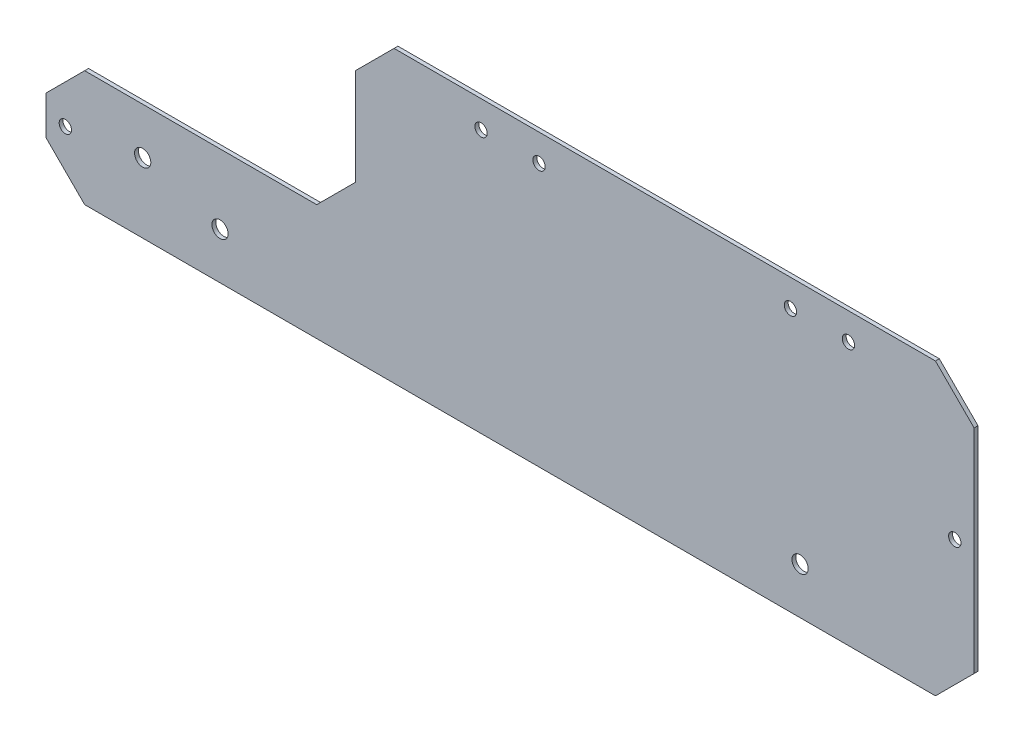
ISO-10303-21;
HEADER;
FILE_DESCRIPTION(('STEP AP214'),'2;1');
FILE_NAME('part.step','',(''),(''),'','','');
FILE_SCHEMA(('AUTOMOTIVE_DESIGN { 1 0 10303 214 1 1 1 1 }'));
ENDSEC;
DATA;
#1=APPLICATION_CONTEXT('core data for automotive mechanical design processes');
#2=APPLICATION_PROTOCOL_DEFINITION('international standard','automotive_design',2000,#1);
#3=PRODUCT_CONTEXT('',#1,'mechanical');
#4=PRODUCT('Part','Part','',(#3));
#5=PRODUCT_RELATED_PRODUCT_CATEGORY('part','',(#4));
#6=PRODUCT_DEFINITION_FORMATION('','',#4);
#7=PRODUCT_DEFINITION_CONTEXT('part definition',#1,'design');
#8=PRODUCT_DEFINITION('design','',#6,#7);
#9=PRODUCT_DEFINITION_SHAPE('','',#8);
#10=(LENGTH_UNIT() NAMED_UNIT(*) SI_UNIT(.MILLI.,.METRE.));
#11=(NAMED_UNIT(*) PLANE_ANGLE_UNIT() SI_UNIT($,.RADIAN.));
#12=(NAMED_UNIT(*) SI_UNIT($,.STERADIAN.) SOLID_ANGLE_UNIT());
#13=UNCERTAINTY_MEASURE_WITH_UNIT(LENGTH_MEASURE(1.E-05),#10,'distance_accuracy_value','');
#14=(GEOMETRIC_REPRESENTATION_CONTEXT(3) GLOBAL_UNCERTAINTY_ASSIGNED_CONTEXT((#13)) GLOBAL_UNIT_ASSIGNED_CONTEXT((#10,
#11,#12)) REPRESENTATION_CONTEXT('',''));
#15=CARTESIAN_POINT('',(0.,0.,0.));
#16=DIRECTION('',(0.,0.,1.));
#17=DIRECTION('',(1.,0.,0.));
#18=AXIS2_PLACEMENT_3D('',#15,#16,#17);
#19=CARTESIAN_POINT('',(0.,0.,1.));
#20=DIRECTION('',(1.,0.,0.));
#21=DIRECTION('',(0.,0.,-1.));
#22=AXIS2_PLACEMENT_3D('',#19,#20,#21);
#23=PLANE('',#22);
#24=DIRECTION('',(0.,-1.,0.));
#25=VECTOR('',#24,1.);
#26=CARTESIAN_POINT('',(0.,0.,0.));
#27=LINE('',#26,#25);
#28=CARTESIAN_POINT('',(0.,20.,0.));
#29=VERTEX_POINT('',#28);
#30=CARTESIAN_POINT('',(0.,10.,0.));
#31=VERTEX_POINT('',#30);
#32=EDGE_CURVE('E195',#29,#31,#27,.T.);
#33=ORIENTED_EDGE('',*,*,#32,.T.);
#34=DIRECTION('',(0.,0.,1.));
#35=VECTOR('',#34,1.);
#36=CARTESIAN_POINT('',(0.,10.,1.));
#37=LINE('',#36,#35);
#38=CARTESIAN_POINT('',(0.,10.,1.));
#39=VERTEX_POINT('',#38);
#40=EDGE_CURVE('E270',#31,#39,#37,.T.);
#41=ORIENTED_EDGE('',*,*,#40,.T.);
#42=DIRECTION('',(0.,-1.,0.));
#43=VECTOR('',#42,1.);
#44=CARTESIAN_POINT('',(0.,0.,1.));
#45=LINE('',#44,#43);
#46=CARTESIAN_POINT('',(0.,20.,1.));
#47=VERTEX_POINT('',#46);
#48=EDGE_CURVE('E194',#47,#39,#45,.T.);
#49=ORIENTED_EDGE('',*,*,#48,.F.);
#50=DIRECTION('',(0.,0.,-1.));
#51=VECTOR('',#50,1.);
#52=CARTESIAN_POINT('',(0.,20.,1.));
#53=LINE('',#52,#51);
#54=EDGE_CURVE('E265',#47,#29,#53,.T.);
#55=ORIENTED_EDGE('',*,*,#54,.T.);
#56=EDGE_LOOP('',(#33,#41,#49,#55));
#57=FACE_BOUND('',#56,.T.);
#58=ADVANCED_FACE('F51',(#57),#23,.F.);
#59=CARTESIAN_POINT('',(0.,0.,1.));
#60=DIRECTION('',(0.,1.,0.));
#61=DIRECTION('',(-1.,0.,0.));
#62=AXIS2_PLACEMENT_3D('',#59,#60,#61);
#63=PLANE('',#62);
#64=DIRECTION('',(1.,0.,0.));
#65=VECTOR('',#64,1.);
#66=CARTESIAN_POINT('',(0.,0.,1.));
#67=LINE('',#66,#65);
#68=CARTESIAN_POINT('',(10.,0.,1.));
#69=VERTEX_POINT('',#68);
#70=CARTESIAN_POINT('',(230.,0.,1.));
#71=VERTEX_POINT('',#70);
#72=EDGE_CURVE('E196',#69,#71,#67,.T.);
#73=ORIENTED_EDGE('',*,*,#72,.F.);
#74=DIRECTION('',(0.,0.,-1.));
#75=VECTOR('',#74,1.);
#76=CARTESIAN_POINT('',(10.,0.,1.));
#77=LINE('',#76,#75);
#78=CARTESIAN_POINT('',(10.,0.,0.));
#79=VERTEX_POINT('',#78);
#80=EDGE_CURVE('E256',#69,#79,#77,.T.);
#81=ORIENTED_EDGE('',*,*,#80,.T.);
#82=DIRECTION('',(1.,0.,0.));
#83=VECTOR('',#82,1.);
#84=CARTESIAN_POINT('',(0.,0.,0.));
#85=LINE('',#84,#83);
#86=CARTESIAN_POINT('',(230.,0.,0.));
#87=VERTEX_POINT('',#86);
#88=EDGE_CURVE('E212',#79,#87,#85,.T.);
#89=ORIENTED_EDGE('',*,*,#88,.T.);
#90=DIRECTION('',(0.,0.,1.));
#91=VECTOR('',#90,1.);
#92=CARTESIAN_POINT('',(230.,0.,1.));
#93=LINE('',#92,#91);
#94=EDGE_CURVE('E257',#87,#71,#93,.T.);
#95=ORIENTED_EDGE('',*,*,#94,.T.);
#96=EDGE_LOOP('',(#73,#81,#89,#95));
#97=FACE_BOUND('',#96,.T.);
#98=ADVANCED_FACE('F418',(#97),#63,.F.);
#99=CARTESIAN_POINT('',(240.,0.,1.));
#100=DIRECTION('',(-1.,0.,0.));
#101=DIRECTION('',(0.,-1.,0.));
#102=AXIS2_PLACEMENT_3D('',#99,#100,#101);
#103=PLANE('',#102);
#104=DIRECTION('',(0.,1.,0.));
#105=VECTOR('',#104,1.);
#106=CARTESIAN_POINT('',(240.,0.,0.));
#107=LINE('',#106,#105);
#108=CARTESIAN_POINT('',(240.,10.0000000000001,0.));
#109=VERTEX_POINT('',#108);
#110=CARTESIAN_POINT('',(240.,65.,0.));
#111=VERTEX_POINT('',#110);
#112=EDGE_CURVE('E213',#109,#111,#107,.T.);
#113=ORIENTED_EDGE('',*,*,#112,.T.);
#114=DIRECTION('',(0.,0.,1.));
#115=VECTOR('',#114,1.);
#116=CARTESIAN_POINT('',(240.,65.,1.));
#117=LINE('',#116,#115);
#118=CARTESIAN_POINT('',(240.,65.,1.));
#119=VERTEX_POINT('',#118);
#120=EDGE_CURVE('E70',#111,#119,#117,.T.);
#121=ORIENTED_EDGE('',*,*,#120,.T.);
#122=DIRECTION('',(0.,1.,0.));
#123=VECTOR('',#122,1.);
#124=CARTESIAN_POINT('',(240.,0.,1.));
#125=LINE('',#124,#123);
#126=CARTESIAN_POINT('',(240.,10.0000000000001,1.));
#127=VERTEX_POINT('',#126);
#128=EDGE_CURVE('E201',#127,#119,#125,.T.);
#129=ORIENTED_EDGE('',*,*,#128,.F.);
#130=DIRECTION('',(0.,0.,-1.));
#131=VECTOR('',#130,1.);
#132=CARTESIAN_POINT('',(240.,10.0000000000001,1.));
#133=LINE('',#132,#131);
#134=EDGE_CURVE('E249',#127,#109,#133,.T.);
#135=ORIENTED_EDGE('',*,*,#134,.T.);
#136=EDGE_LOOP('',(#113,#121,#129,#135));
#137=FACE_BOUND('',#136,.T.);
#138=ADVANCED_FACE('F421',(#137),#103,.F.);
#139=CARTESIAN_POINT('',(0.,75.,1.));
#140=DIRECTION('',(0.,-1.,0.));
#141=DIRECTION('',(1.,0.,0.));
#142=AXIS2_PLACEMENT_3D('',#139,#140,#141);
#143=PLANE('',#142);
#144=DIRECTION('',(-1.,0.,0.));
#145=VECTOR('',#144,1.);
#146=CARTESIAN_POINT('',(0.,75.,0.));
#147=LINE('',#146,#145);
#148=CARTESIAN_POINT('',(230.,75.,0.));
#149=VERTEX_POINT('',#148);
#150=CARTESIAN_POINT('',(90.,75.,0.));
#151=VERTEX_POINT('',#150);
#152=EDGE_CURVE('E200',#149,#151,#147,.T.);
#153=ORIENTED_EDGE('',*,*,#152,.T.);
#154=DIRECTION('',(0.,0.,1.));
#155=VECTOR('',#154,1.);
#156=CARTESIAN_POINT('',(90.,75.,1.));
#157=LINE('',#156,#155);
#158=CARTESIAN_POINT('',(90.,75.,1.));
#159=VERTEX_POINT('',#158);
#160=EDGE_CURVE('E149',#151,#159,#157,.T.);
#161=ORIENTED_EDGE('',*,*,#160,.T.);
#162=DIRECTION('',(-1.,0.,0.));
#163=VECTOR('',#162,1.);
#164=CARTESIAN_POINT('',(0.,75.,1.));
#165=LINE('',#164,#163);
#166=CARTESIAN_POINT('',(230.,75.,1.));
#167=VERTEX_POINT('',#166);
#168=EDGE_CURVE('E202',#167,#159,#165,.T.);
#169=ORIENTED_EDGE('',*,*,#168,.F.);
#170=DIRECTION('',(0.,0.,-1.));
#171=VECTOR('',#170,1.);
#172=CARTESIAN_POINT('',(230.,75.,1.));
#173=LINE('',#172,#171);
#174=EDGE_CURVE('E153',#167,#149,#173,.T.);
#175=ORIENTED_EDGE('',*,*,#174,.T.);
#176=EDGE_LOOP('',(#153,#161,#169,#175));
#177=FACE_BOUND('',#176,.T.);
#178=ADVANCED_FACE('F482',(#177),#143,.F.);
#179=CARTESIAN_POINT('',(0.,0.,1.));
#180=DIRECTION('',(0.,0.,-1.));
#181=DIRECTION('',(-1.,0.,0.));
#182=AXIS2_PLACEMENT_3D('',#179,#180,#181);
#183=PLANE('',#182);
#184=CARTESIAN_POINT('',(5.,15.,0.999999999999999));
#185=DIRECTION('',(0.,0.,-1.));
#186=DIRECTION('',(-1.,0.,0.));
#187=AXIS2_PLACEMENT_3D('',#184,#185,#186);
#188=CIRCLE('',#187,1.6);
#189=CARTESIAN_POINT('',(3.4,15.,0.999999999999999));
#190=VERTEX_POINT('',#189);
#191=EDGE_CURVE('E173',#190,#190,#188,.T.);
#192=ORIENTED_EDGE('',*,*,#191,.T.);
#193=EDGE_LOOP('',(#192));
#194=FACE_BOUND('',#193,.T.);
#195=CARTESIAN_POINT('',(25.,18.,0.999999999999999));
#196=DIRECTION('',(0.,0.,-1.));
#197=DIRECTION('',(-1.,0.,0.));
#198=AXIS2_PLACEMENT_3D('',#195,#196,#197);
#199=CIRCLE('',#198,2.1);
#200=CARTESIAN_POINT('',(22.9,18.,0.999999999999999));
#201=VERTEX_POINT('',#200);
#202=EDGE_CURVE('E185',#201,#201,#199,.T.);
#203=ORIENTED_EDGE('',*,*,#202,.T.);
#204=EDGE_LOOP('',(#203));
#205=FACE_BOUND('',#204,.T.);
#206=CARTESIAN_POINT('',(112.5,68.,0.999999999999999));
#207=DIRECTION('',(0.,0.,-1.));
#208=DIRECTION('',(-1.,0.,0.));
#209=AXIS2_PLACEMENT_3D('',#206,#207,#208);
#210=CIRCLE('',#209,1.59999999999999);
#211=CARTESIAN_POINT('',(110.9,68.,0.999999999999999));
#212=VERTEX_POINT('',#211);
#213=EDGE_CURVE('E328',#212,#212,#210,.T.);
#214=ORIENTED_EDGE('',*,*,#213,.T.);
#215=EDGE_LOOP('',(#214));
#216=FACE_BOUND('',#215,.T.);
#217=CARTESIAN_POINT('',(127.5,68.,0.999999999999999));
#218=DIRECTION('',(0.,0.,-1.));
#219=DIRECTION('',(-1.,0.,0.));
#220=AXIS2_PLACEMENT_3D('',#217,#218,#219);
#221=CIRCLE('',#220,1.59999999999999);
#222=CARTESIAN_POINT('',(125.9,68.,0.999999999999999));
#223=VERTEX_POINT('',#222);
#224=EDGE_CURVE('E371',#223,#223,#221,.T.);
#225=ORIENTED_EDGE('',*,*,#224,.T.);
#226=EDGE_LOOP('',(#225));
#227=FACE_BOUND('',#226,.T.);
#228=CARTESIAN_POINT('',(192.5,68.,0.999999999999999));
#229=DIRECTION('',(0.,0.,-1.));
#230=DIRECTION('',(-1.,0.,0.));
#231=AXIS2_PLACEMENT_3D('',#228,#229,#230);
#232=CIRCLE('',#231,1.59999999999999);
#233=CARTESIAN_POINT('',(190.9,68.,0.999999999999999));
#234=VERTEX_POINT('',#233);
#235=EDGE_CURVE('E306',#234,#234,#232,.T.);
#236=ORIENTED_EDGE('',*,*,#235,.T.);
#237=EDGE_LOOP('',(#236));
#238=FACE_BOUND('',#237,.T.);
#239=CARTESIAN_POINT('',(207.5,68.,0.999999999999999));
#240=DIRECTION('',(0.,0.,-1.));
#241=DIRECTION('',(-1.,0.,0.));
#242=AXIS2_PLACEMENT_3D('',#239,#240,#241);
#243=CIRCLE('',#242,1.59999999999999);
#244=CARTESIAN_POINT('',(205.9,68.,0.999999999999999));
#245=VERTEX_POINT('',#244);
#246=EDGE_CURVE('E303',#245,#245,#243,.T.);
#247=ORIENTED_EDGE('',*,*,#246,.T.);
#248=EDGE_LOOP('',(#247));
#249=FACE_BOUND('',#248,.T.);
#250=CARTESIAN_POINT('',(235.,37.5,0.999999999999999));
#251=DIRECTION('',(0.,0.,-1.));
#252=DIRECTION('',(-1.,0.,0.));
#253=AXIS2_PLACEMENT_3D('',#250,#251,#252);
#254=CIRCLE('',#253,1.59999999999999);
#255=CARTESIAN_POINT('',(233.4,37.5,0.999999999999999));
#256=VERTEX_POINT('',#255);
#257=EDGE_CURVE('E310',#256,#256,#254,.T.);
#258=ORIENTED_EDGE('',*,*,#257,.T.);
#259=EDGE_LOOP('',(#258));
#260=FACE_BOUND('',#259,.T.);
#261=CARTESIAN_POINT('',(45.,12.,0.999999999999999));
#262=DIRECTION('',(0.,0.,-1.));
#263=DIRECTION('',(-1.,0.,0.));
#264=AXIS2_PLACEMENT_3D('',#261,#262,#263);
#265=CIRCLE('',#264,2.1);
#266=CARTESIAN_POINT('',(42.9,12.,0.999999999999999));
#267=VERTEX_POINT('',#266);
#268=EDGE_CURVE('E362',#267,#267,#265,.T.);
#269=ORIENTED_EDGE('',*,*,#268,.T.);
#270=EDGE_LOOP('',(#269));
#271=FACE_BOUND('',#270,.T.);
#272=CARTESIAN_POINT('',(195.,12.,0.999999999999999));
#273=DIRECTION('',(0.,0.,-1.));
#274=DIRECTION('',(-1.,0.,0.));
#275=AXIS2_PLACEMENT_3D('',#272,#273,#274);
#276=CIRCLE('',#275,2.09999999999999);
#277=CARTESIAN_POINT('',(192.9,12.,0.999999999999999));
#278=VERTEX_POINT('',#277);
#279=EDGE_CURVE('E320',#278,#278,#276,.T.);
#280=ORIENTED_EDGE('',*,*,#279,.T.);
#281=EDGE_LOOP('',(#280));
#282=FACE_BOUND('',#281,.T.);
#283=ORIENTED_EDGE('',*,*,#168,.T.);
#284=DIRECTION('',(0.707106781186548,0.707106781186548,0.));
#285=VECTOR('',#284,1.);
#286=CARTESIAN_POINT('',(80.,65.,0.999999999999999));
#287=LINE('',#286,#285);
#288=CARTESIAN_POINT('',(80.,65.,1.));
#289=VERTEX_POINT('',#288);
#290=EDGE_CURVE('E250',#159,#289,#287,.F.);
#291=ORIENTED_EDGE('',*,*,#290,.T.);
#292=DIRECTION('',(0.,-1.,0.));
#293=VECTOR('',#292,1.);
#294=CARTESIAN_POINT('',(80.,0.,1.));
#295=LINE('',#294,#293);
#296=CARTESIAN_POINT('',(80.,40.,1.));
#297=VERTEX_POINT('',#296);
#298=EDGE_CURVE('E165',#289,#297,#295,.T.);
#299=ORIENTED_EDGE('',*,*,#298,.T.);
#300=DIRECTION('',(0.707106781186551,0.707106781186544,0.));
#301=VECTOR('',#300,1.);
#302=CARTESIAN_POINT('',(19.9999999999996,-19.9999999999998,1.));
#303=LINE('',#302,#301);
#304=CARTESIAN_POINT('',(69.9999999999999,30.,1.));
#305=VERTEX_POINT('',#304);
#306=EDGE_CURVE('E11',#297,#305,#303,.F.);
#307=ORIENTED_EDGE('',*,*,#306,.T.);
#308=DIRECTION('',(-1.,0.,0.));
#309=VECTOR('',#308,1.);
#310=CARTESIAN_POINT('',(0.,30.,1.));
#311=LINE('',#310,#309);
#312=CARTESIAN_POINT('',(10.,30.,1.));
#313=VERTEX_POINT('',#312);
#314=EDGE_CURVE('E189',#305,#313,#311,.T.);
#315=ORIENTED_EDGE('',*,*,#314,.T.);
#316=DIRECTION('',(0.707106781186548,0.707106781186548,0.));
#317=VECTOR('',#316,1.);
#318=CARTESIAN_POINT('',(0.,20.,1.));
#319=LINE('',#318,#317);
#320=EDGE_CURVE('E237',#313,#47,#319,.F.);
#321=ORIENTED_EDGE('',*,*,#320,.T.);
#322=ORIENTED_EDGE('',*,*,#48,.T.);
#323=DIRECTION('',(-0.707106781186548,0.707106781186548,0.));
#324=VECTOR('',#323,1.);
#325=CARTESIAN_POINT('',(10.,0.,1.));
#326=LINE('',#325,#324);
#327=EDGE_CURVE('E245',#39,#69,#326,.F.);
#328=ORIENTED_EDGE('',*,*,#327,.T.);
#329=ORIENTED_EDGE('',*,*,#72,.T.);
#330=DIRECTION('',(-0.707106781186548,-0.707106781186548,0.));
#331=VECTOR('',#330,1.);
#332=CARTESIAN_POINT('',(240.,10.0000000000001,1.));
#333=LINE('',#332,#331);
#334=EDGE_CURVE('E74',#71,#127,#333,.F.);
#335=ORIENTED_EDGE('',*,*,#334,.T.);
#336=ORIENTED_EDGE('',*,*,#128,.T.);
#337=DIRECTION('',(0.707106781186548,-0.707106781186548,0.));
#338=VECTOR('',#337,1.);
#339=CARTESIAN_POINT('',(230.,75.,1.));
#340=LINE('',#339,#338);
#341=EDGE_CURVE('E244',#119,#167,#340,.F.);
#342=ORIENTED_EDGE('',*,*,#341,.T.);
#343=EDGE_LOOP('',(#283,#291,#299,#307,#315,#321,#322,#328,#329,#335,#336,#342));
#344=FACE_BOUND('',#343,.T.);
#345=ADVANCED_FACE('F399',(#194,#205,#216,#227,#238,#249,#260,#271,#282,#344),#183,.F.);
#346=CARTESIAN_POINT('',(0.,0.,0.));
#347=DIRECTION('',(0.,0.,-1.));
#348=DIRECTION('',(-1.,0.,0.));
#349=AXIS2_PLACEMENT_3D('',#346,#347,#348);
#350=PLANE('',#349);
#351=CARTESIAN_POINT('',(5.,15.,0.));
#352=DIRECTION('',(0.,0.,-1.));
#353=DIRECTION('',(-1.,0.,0.));
#354=AXIS2_PLACEMENT_3D('',#351,#352,#353);
#355=CIRCLE('',#354,1.6);
#356=CARTESIAN_POINT('',(3.4,15.,0.));
#357=VERTEX_POINT('',#356);
#358=EDGE_CURVE('E296',#357,#357,#355,.T.);
#359=ORIENTED_EDGE('',*,*,#358,.F.);
#360=EDGE_LOOP('',(#359));
#361=FACE_BOUND('',#360,.T.);
#362=CARTESIAN_POINT('',(25.,18.,0.));
#363=DIRECTION('',(0.,0.,-1.));
#364=DIRECTION('',(-1.,0.,0.));
#365=AXIS2_PLACEMENT_3D('',#362,#363,#364);
#366=CIRCLE('',#365,2.1);
#367=CARTESIAN_POINT('',(22.9,18.,0.));
#368=VERTEX_POINT('',#367);
#369=EDGE_CURVE('E286',#368,#368,#366,.T.);
#370=ORIENTED_EDGE('',*,*,#369,.F.);
#371=EDGE_LOOP('',(#370));
#372=FACE_BOUND('',#371,.T.);
#373=CARTESIAN_POINT('',(112.5,68.,0.));
#374=DIRECTION('',(0.,0.,-1.));
#375=DIRECTION('',(1.,0.,0.));
#376=AXIS2_PLACEMENT_3D('',#373,#374,#375);
#377=CIRCLE('',#376,1.59999999999999);
#378=CARTESIAN_POINT('',(114.1,68.,0.));
#379=VERTEX_POINT('',#378);
#380=EDGE_CURVE('E281',#379,#379,#377,.T.);
#381=ORIENTED_EDGE('',*,*,#380,.F.);
#382=EDGE_LOOP('',(#381));
#383=FACE_BOUND('',#382,.T.);
#384=CARTESIAN_POINT('',(127.5,68.,0.));
#385=DIRECTION('',(0.,0.,-1.));
#386=DIRECTION('',(1.,0.,0.));
#387=AXIS2_PLACEMENT_3D('',#384,#385,#386);
#388=CIRCLE('',#387,1.59999999999999);
#389=CARTESIAN_POINT('',(129.1,68.,0.));
#390=VERTEX_POINT('',#389);
#391=EDGE_CURVE('E282',#390,#390,#388,.T.);
#392=ORIENTED_EDGE('',*,*,#391,.F.);
#393=EDGE_LOOP('',(#392));
#394=FACE_BOUND('',#393,.T.);
#395=CARTESIAN_POINT('',(192.5,68.,0.));
#396=DIRECTION('',(0.,0.,-1.));
#397=DIRECTION('',(-1.,0.,0.));
#398=AXIS2_PLACEMENT_3D('',#395,#396,#397);
#399=CIRCLE('',#398,1.59999999999999);
#400=CARTESIAN_POINT('',(190.9,68.,0.));
#401=VERTEX_POINT('',#400);
#402=EDGE_CURVE('E323',#401,#401,#399,.T.);
#403=ORIENTED_EDGE('',*,*,#402,.F.);
#404=EDGE_LOOP('',(#403));
#405=FACE_BOUND('',#404,.T.);
#406=CARTESIAN_POINT('',(207.5,68.,0.));
#407=DIRECTION('',(0.,0.,-1.));
#408=DIRECTION('',(-1.,0.,0.));
#409=AXIS2_PLACEMENT_3D('',#406,#407,#408);
#410=CIRCLE('',#409,1.59999999999999);
#411=CARTESIAN_POINT('',(205.9,68.,0.));
#412=VERTEX_POINT('',#411);
#413=EDGE_CURVE('E344',#412,#412,#410,.T.);
#414=ORIENTED_EDGE('',*,*,#413,.F.);
#415=EDGE_LOOP('',(#414));
#416=FACE_BOUND('',#415,.T.);
#417=CARTESIAN_POINT('',(235.,37.5,0.));
#418=DIRECTION('',(0.,0.,-1.));
#419=DIRECTION('',(-1.,0.,0.));
#420=AXIS2_PLACEMENT_3D('',#417,#418,#419);
#421=CIRCLE('',#420,1.59999999999999);
#422=CARTESIAN_POINT('',(233.4,37.5,0.));
#423=VERTEX_POINT('',#422);
#424=EDGE_CURVE('E339',#423,#423,#421,.T.);
#425=ORIENTED_EDGE('',*,*,#424,.F.);
#426=EDGE_LOOP('',(#425));
#427=FACE_BOUND('',#426,.T.);
#428=CARTESIAN_POINT('',(45.,12.,0.));
#429=DIRECTION('',(0.,0.,-1.));
#430=DIRECTION('',(-1.,0.,0.));
#431=AXIS2_PLACEMENT_3D('',#428,#429,#430);
#432=CIRCLE('',#431,2.1);
#433=CARTESIAN_POINT('',(42.9,12.,0.));
#434=VERTEX_POINT('',#433);
#435=EDGE_CURVE('E299',#434,#434,#432,.T.);
#436=ORIENTED_EDGE('',*,*,#435,.F.);
#437=EDGE_LOOP('',(#436));
#438=FACE_BOUND('',#437,.T.);
#439=CARTESIAN_POINT('',(195.,12.,0.));
#440=DIRECTION('',(0.,0.,-1.));
#441=DIRECTION('',(-1.,0.,0.));
#442=AXIS2_PLACEMENT_3D('',#439,#440,#441);
#443=CIRCLE('',#442,2.09999999999999);
#444=CARTESIAN_POINT('',(192.9,12.,0.));
#445=VERTEX_POINT('',#444);
#446=EDGE_CURVE('E295',#445,#445,#443,.T.);
#447=ORIENTED_EDGE('',*,*,#446,.F.);
#448=EDGE_LOOP('',(#447));
#449=FACE_BOUND('',#448,.T.);
#450=DIRECTION('',(0.,-1.,0.));
#451=VECTOR('',#450,1.);
#452=CARTESIAN_POINT('',(80.,75.,0.));
#453=LINE('',#452,#451);
#454=CARTESIAN_POINT('',(80.,65.,0.));
#455=VERTEX_POINT('',#454);
#456=CARTESIAN_POINT('',(80.,40.,0.));
#457=VERTEX_POINT('',#456);
#458=EDGE_CURVE('E163',#455,#457,#453,.T.);
#459=ORIENTED_EDGE('',*,*,#458,.F.);
#460=DIRECTION('',(-0.707106781186548,-0.707106781186548,0.));
#461=VECTOR('',#460,1.);
#462=CARTESIAN_POINT('',(7.50000000000001,-7.50000000000001,0.));
#463=LINE('',#462,#461);
#464=EDGE_CURVE('E141',#455,#151,#463,.F.);
#465=ORIENTED_EDGE('',*,*,#464,.T.);
#466=ORIENTED_EDGE('',*,*,#152,.F.);
#467=DIRECTION('',(-0.707106781186548,0.707106781186548,0.));
#468=VECTOR('',#467,1.);
#469=CARTESIAN_POINT('',(152.5,152.5,0.));
#470=LINE('',#469,#468);
#471=EDGE_CURVE('E152',#149,#111,#470,.F.);
#472=ORIENTED_EDGE('',*,*,#471,.T.);
#473=ORIENTED_EDGE('',*,*,#112,.F.);
#474=DIRECTION('',(0.707106781186548,0.707106781186548,0.));
#475=VECTOR('',#474,1.);
#476=CARTESIAN_POINT('',(115.,-115.,0.));
#477=LINE('',#476,#475);
#478=EDGE_CURVE('E168',#109,#87,#477,.F.);
#479=ORIENTED_EDGE('',*,*,#478,.T.);
#480=ORIENTED_EDGE('',*,*,#88,.F.);
#481=DIRECTION('',(0.707106781186548,-0.707106781186548,0.));
#482=VECTOR('',#481,1.);
#483=CARTESIAN_POINT('',(5.00000000000002,5.00000000000002,0.));
#484=LINE('',#483,#482);
#485=EDGE_CURVE('E227',#79,#31,#484,.F.);
#486=ORIENTED_EDGE('',*,*,#485,.T.);
#487=ORIENTED_EDGE('',*,*,#32,.F.);
#488=DIRECTION('',(-0.707106781186548,-0.707106781186548,0.));
#489=VECTOR('',#488,1.);
#490=CARTESIAN_POINT('',(-9.99999999999999,9.99999999999999,0.));
#491=LINE('',#490,#489);
#492=CARTESIAN_POINT('',(10.,30.,0.));
#493=VERTEX_POINT('',#492);
#494=EDGE_CURVE('E222',#29,#493,#491,.F.);
#495=ORIENTED_EDGE('',*,*,#494,.T.);
#496=DIRECTION('',(-1.,0.,0.));
#497=VECTOR('',#496,1.);
#498=CARTESIAN_POINT('',(80.,30.,0.));
#499=LINE('',#498,#497);
#500=CARTESIAN_POINT('',(69.9999999999999,30.,0.));
#501=VERTEX_POINT('',#500);
#502=EDGE_CURVE('E175',#501,#493,#499,.T.);
#503=ORIENTED_EDGE('',*,*,#502,.F.);
#504=DIRECTION('',(-0.707106781186551,-0.707106781186544,0.));
#505=VECTOR('',#504,1.);
#506=CARTESIAN_POINT('',(69.9999999999999,30.,0.));
#507=LINE('',#506,#505);
#508=EDGE_CURVE('E62',#501,#457,#507,.F.);
#509=ORIENTED_EDGE('',*,*,#508,.T.);
#510=EDGE_LOOP('',(#459,#465,#466,#472,#473,#479,#480,#486,#487,#495,#503,#509));
#511=FACE_BOUND('',#510,.T.);
#512=ADVANCED_FACE('F169',(#361,#372,#383,#394,#405,#416,#427,#438,#449,#511),#350,.T.);
#513=CARTESIAN_POINT('',(80.,30.,10.));
#514=DIRECTION('',(0.,-1.,0.));
#515=DIRECTION('',(0.,0.,-1.));
#516=AXIS2_PLACEMENT_3D('',#513,#514,#515);
#517=PLANE('',#516);
#518=ORIENTED_EDGE('',*,*,#502,.T.);
#519=DIRECTION('',(0.,0.,1.));
#520=VECTOR('',#519,1.);
#521=CARTESIAN_POINT('',(10.,30.,10.));
#522=LINE('',#521,#520);
#523=EDGE_CURVE('E274',#493,#313,#522,.T.);
#524=ORIENTED_EDGE('',*,*,#523,.T.);
#525=ORIENTED_EDGE('',*,*,#314,.F.);
#526=DIRECTION('',(0.,0.,-1.));
#527=VECTOR('',#526,1.);
#528=CARTESIAN_POINT('',(69.9999999999999,30.,0.));
#529=LINE('',#528,#527);
#530=EDGE_CURVE('E269',#305,#501,#529,.T.);
#531=ORIENTED_EDGE('',*,*,#530,.T.);
#532=EDGE_LOOP('',(#518,#524,#525,#531));
#533=FACE_BOUND('',#532,.T.);
#534=ADVANCED_FACE('F470',(#533),#517,.F.);
#535=CARTESIAN_POINT('',(80.,75.,10.));
#536=DIRECTION('',(1.,0.,0.));
#537=DIRECTION('',(0.,0.,-1.));
#538=AXIS2_PLACEMENT_3D('',#535,#536,#537);
#539=PLANE('',#538);
#540=ORIENTED_EDGE('',*,*,#298,.F.);
#541=DIRECTION('',(0.,0.,-1.));
#542=VECTOR('',#541,1.);
#543=CARTESIAN_POINT('',(80.,65.,10.));
#544=LINE('',#543,#542);
#545=EDGE_CURVE('E150',#289,#455,#544,.T.);
#546=ORIENTED_EDGE('',*,*,#545,.T.);
#547=ORIENTED_EDGE('',*,*,#458,.T.);
#548=DIRECTION('',(0.,0.,1.));
#549=VECTOR('',#548,1.);
#550=CARTESIAN_POINT('',(80.,40.,0.999999999999999));
#551=LINE('',#550,#549);
#552=EDGE_CURVE('E170',#457,#297,#551,.T.);
#553=ORIENTED_EDGE('',*,*,#552,.T.);
#554=EDGE_LOOP('',(#540,#546,#547,#553));
#555=FACE_BOUND('',#554,.T.);
#556=ADVANCED_FACE('F159',(#555),#539,.F.);
#557=CARTESIAN_POINT('',(80.,65.,10.));
#558=DIRECTION('',(0.707106781186547,-0.707106781186547,0.));
#559=DIRECTION('',(0.,0.,-1.));
#560=AXIS2_PLACEMENT_3D('',#557,#558,#559);
#561=PLANE('',#560);
#562=ORIENTED_EDGE('',*,*,#290,.F.);
#563=ORIENTED_EDGE('',*,*,#160,.F.);
#564=ORIENTED_EDGE('',*,*,#464,.F.);
#565=ORIENTED_EDGE('',*,*,#545,.F.);
#566=EDGE_LOOP('',(#562,#563,#564,#565));
#567=FACE_BOUND('',#566,.T.);
#568=ADVANCED_FACE('F147',(#567),#561,.F.);
#569=CARTESIAN_POINT('',(230.,75.,1.));
#570=DIRECTION('',(-0.707106781186547,-0.707106781186547,0.));
#571=DIRECTION('',(0.,0.,-1.));
#572=AXIS2_PLACEMENT_3D('',#569,#570,#571);
#573=PLANE('',#572);
#574=ORIENTED_EDGE('',*,*,#341,.F.);
#575=ORIENTED_EDGE('',*,*,#120,.F.);
#576=ORIENTED_EDGE('',*,*,#471,.F.);
#577=ORIENTED_EDGE('',*,*,#174,.F.);
#578=EDGE_LOOP('',(#574,#575,#576,#577));
#579=FACE_BOUND('',#578,.T.);
#580=ADVANCED_FACE('F432',(#579),#573,.F.);
#581=CARTESIAN_POINT('',(10.,0.,1.));
#582=DIRECTION('',(0.707106781186547,0.707106781186547,0.));
#583=DIRECTION('',(0.,0.,-1.));
#584=AXIS2_PLACEMENT_3D('',#581,#582,#583);
#585=PLANE('',#584);
#586=ORIENTED_EDGE('',*,*,#327,.F.);
#587=ORIENTED_EDGE('',*,*,#40,.F.);
#588=ORIENTED_EDGE('',*,*,#485,.F.);
#589=ORIENTED_EDGE('',*,*,#80,.F.);
#590=EDGE_LOOP('',(#586,#587,#588,#589));
#591=FACE_BOUND('',#590,.T.);
#592=ADVANCED_FACE('F439',(#591),#585,.F.);
#593=CARTESIAN_POINT('',(0.,20.,1.));
#594=DIRECTION('',(0.707106781186547,-0.707106781186547,0.));
#595=DIRECTION('',(0.,0.,-1.));
#596=AXIS2_PLACEMENT_3D('',#593,#594,#595);
#597=PLANE('',#596);
#598=ORIENTED_EDGE('',*,*,#320,.F.);
#599=ORIENTED_EDGE('',*,*,#523,.F.);
#600=ORIENTED_EDGE('',*,*,#494,.F.);
#601=ORIENTED_EDGE('',*,*,#54,.F.);
#602=EDGE_LOOP('',(#598,#599,#600,#601));
#603=FACE_BOUND('',#602,.T.);
#604=ADVANCED_FACE('F450',(#603),#597,.F.);
#605=CARTESIAN_POINT('',(69.9999999999999,30.,10.));
#606=DIRECTION('',(-0.707106781186543,0.707106781186551,0.));
#607=DIRECTION('',(0.,0.,1.));
#608=AXIS2_PLACEMENT_3D('',#605,#606,#607);
#609=PLANE('',#608);
#610=ORIENTED_EDGE('',*,*,#306,.F.);
#611=ORIENTED_EDGE('',*,*,#552,.F.);
#612=ORIENTED_EDGE('',*,*,#508,.F.);
#613=ORIENTED_EDGE('',*,*,#530,.F.);
#614=EDGE_LOOP('',(#610,#611,#612,#613));
#615=FACE_BOUND('',#614,.T.);
#616=ADVANCED_FACE('F454',(#615),#609,.T.);
#617=CARTESIAN_POINT('',(240.,10.0000000000001,1.));
#618=DIRECTION('',(-0.707106781186547,0.707106781186547,0.));
#619=DIRECTION('',(0.,0.,-1.));
#620=AXIS2_PLACEMENT_3D('',#617,#618,#619);
#621=PLANE('',#620);
#622=ORIENTED_EDGE('',*,*,#334,.F.);
#623=ORIENTED_EDGE('',*,*,#94,.F.);
#624=ORIENTED_EDGE('',*,*,#478,.F.);
#625=ORIENTED_EDGE('',*,*,#134,.F.);
#626=EDGE_LOOP('',(#622,#623,#624,#625));
#627=FACE_BOUND('',#626,.T.);
#628=ADVANCED_FACE('F53',(#627),#621,.F.);
#629=CARTESIAN_POINT('',(195.,12.,10.));
#630=DIRECTION('',(0.,0.,-1.));
#631=DIRECTION('',(-1.,0.,0.));
#632=AXIS2_PLACEMENT_3D('',#629,#630,#631);
#633=CYLINDRICAL_SURFACE('',#632,2.09999999999999);
#634=ORIENTED_EDGE('',*,*,#446,.T.);
#635=EDGE_LOOP('',(#634));
#636=FACE_BOUND('',#635,.T.);
#637=ORIENTED_EDGE('',*,*,#279,.F.);
#638=EDGE_LOOP('',(#637));
#639=FACE_BOUND('',#638,.T.);
#640=ADVANCED_FACE('F407',(#636,#639),#633,.F.);
#641=CARTESIAN_POINT('',(45.,12.,10.));
#642=DIRECTION('',(0.,0.,-1.));
#643=DIRECTION('',(-1.,0.,0.));
#644=AXIS2_PLACEMENT_3D('',#641,#642,#643);
#645=CYLINDRICAL_SURFACE('',#644,2.1);
#646=ORIENTED_EDGE('',*,*,#435,.T.);
#647=EDGE_LOOP('',(#646));
#648=FACE_BOUND('',#647,.T.);
#649=ORIENTED_EDGE('',*,*,#268,.F.);
#650=EDGE_LOOP('',(#649));
#651=FACE_BOUND('',#650,.T.);
#652=ADVANCED_FACE('F401',(#648,#651),#645,.F.);
#653=CARTESIAN_POINT('',(235.,37.5,10.));
#654=DIRECTION('',(0.,0.,-1.));
#655=DIRECTION('',(-1.,0.,0.));
#656=AXIS2_PLACEMENT_3D('',#653,#654,#655);
#657=CYLINDRICAL_SURFACE('',#656,1.59999999999999);
#658=ORIENTED_EDGE('',*,*,#424,.T.);
#659=EDGE_LOOP('',(#658));
#660=FACE_BOUND('',#659,.T.);
#661=ORIENTED_EDGE('',*,*,#257,.F.);
#662=EDGE_LOOP('',(#661));
#663=FACE_BOUND('',#662,.T.);
#664=ADVANCED_FACE('F403',(#660,#663),#657,.F.);
#665=CARTESIAN_POINT('',(207.5,68.,10.));
#666=DIRECTION('',(0.,0.,-1.));
#667=DIRECTION('',(-1.,0.,0.));
#668=AXIS2_PLACEMENT_3D('',#665,#666,#667);
#669=CYLINDRICAL_SURFACE('',#668,1.59999999999999);
#670=ORIENTED_EDGE('',*,*,#413,.T.);
#671=EDGE_LOOP('',(#670));
#672=FACE_BOUND('',#671,.T.);
#673=ORIENTED_EDGE('',*,*,#246,.F.);
#674=EDGE_LOOP('',(#673));
#675=FACE_BOUND('',#674,.T.);
#676=ADVANCED_FACE('F411',(#672,#675),#669,.F.);
#677=CARTESIAN_POINT('',(192.5,68.,10.));
#678=DIRECTION('',(0.,0.,-1.));
#679=DIRECTION('',(-1.,0.,0.));
#680=AXIS2_PLACEMENT_3D('',#677,#678,#679);
#681=CYLINDRICAL_SURFACE('',#680,1.59999999999999);
#682=ORIENTED_EDGE('',*,*,#402,.T.);
#683=EDGE_LOOP('',(#682));
#684=FACE_BOUND('',#683,.T.);
#685=ORIENTED_EDGE('',*,*,#235,.F.);
#686=EDGE_LOOP('',(#685));
#687=FACE_BOUND('',#686,.T.);
#688=ADVANCED_FACE('F501',(#684,#687),#681,.F.);
#689=CARTESIAN_POINT('',(127.5,68.,10.));
#690=DIRECTION('',(0.,0.,-1.));
#691=DIRECTION('',(-1.,0.,0.));
#692=AXIS2_PLACEMENT_3D('',#689,#690,#691);
#693=CYLINDRICAL_SURFACE('',#692,1.59999999999999);
#694=ORIENTED_EDGE('',*,*,#391,.T.);
#695=EDGE_LOOP('',(#694));
#696=FACE_BOUND('',#695,.T.);
#697=ORIENTED_EDGE('',*,*,#224,.F.);
#698=EDGE_LOOP('',(#697));
#699=FACE_BOUND('',#698,.T.);
#700=ADVANCED_FACE('F504',(#696,#699),#693,.F.);
#701=CARTESIAN_POINT('',(112.5,68.,10.));
#702=DIRECTION('',(0.,0.,-1.));
#703=DIRECTION('',(-1.,0.,0.));
#704=AXIS2_PLACEMENT_3D('',#701,#702,#703);
#705=CYLINDRICAL_SURFACE('',#704,1.59999999999999);
#706=ORIENTED_EDGE('',*,*,#380,.T.);
#707=EDGE_LOOP('',(#706));
#708=FACE_BOUND('',#707,.T.);
#709=ORIENTED_EDGE('',*,*,#213,.F.);
#710=EDGE_LOOP('',(#709));
#711=FACE_BOUND('',#710,.T.);
#712=ADVANCED_FACE('F526',(#708,#711),#705,.F.);
#713=CARTESIAN_POINT('',(25.,18.,10.));
#714=DIRECTION('',(0.,0.,-1.));
#715=DIRECTION('',(-1.,0.,0.));
#716=AXIS2_PLACEMENT_3D('',#713,#714,#715);
#717=CYLINDRICAL_SURFACE('',#716,2.1);
#718=ORIENTED_EDGE('',*,*,#369,.T.);
#719=EDGE_LOOP('',(#718));
#720=FACE_BOUND('',#719,.T.);
#721=ORIENTED_EDGE('',*,*,#202,.F.);
#722=EDGE_LOOP('',(#721));
#723=FACE_BOUND('',#722,.T.);
#724=ADVANCED_FACE('F533',(#720,#723),#717,.F.);
#725=CARTESIAN_POINT('',(5.,15.,10.));
#726=DIRECTION('',(0.,0.,-1.));
#727=DIRECTION('',(-1.,0.,0.));
#728=AXIS2_PLACEMENT_3D('',#725,#726,#727);
#729=CYLINDRICAL_SURFACE('',#728,1.6);
#730=ORIENTED_EDGE('',*,*,#358,.T.);
#731=EDGE_LOOP('',(#730));
#732=FACE_BOUND('',#731,.T.);
#733=ORIENTED_EDGE('',*,*,#191,.F.);
#734=EDGE_LOOP('',(#733));
#735=FACE_BOUND('',#734,.T.);
#736=ADVANCED_FACE('F532',(#732,#735),#729,.F.);
#737=CLOSED_SHELL('',(#58,#98,#138,#178,#345,#512,#534,#556,#568,#580,#592,#604,#616,#628,#640,
#652,#664,#676,#688,#700,#712,#724,#736));
#738=MANIFOLD_SOLID_BREP('B2',#737);
#739=ADVANCED_BREP_SHAPE_REPRESENTATION('',(#18,#738),#14);
#740=SHAPE_DEFINITION_REPRESENTATION(#9,#739);
ENDSEC;
END-ISO-10303-21;
